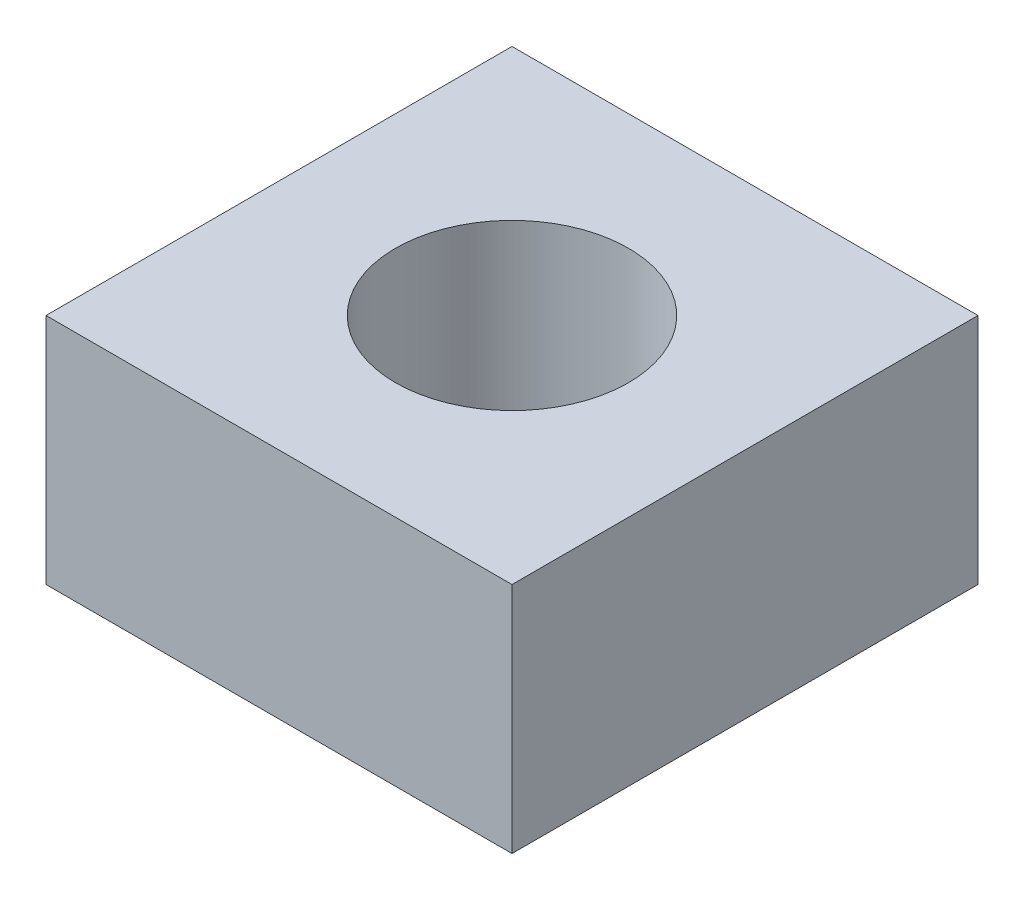
ISO-10303-21;
HEADER;
FILE_DESCRIPTION(('STEP AP214'),'2;1');
FILE_NAME('part.step','',(''),(''),'','','');
FILE_SCHEMA(('AUTOMOTIVE_DESIGN { 1 0 10303 214 1 1 1 1 }'));
ENDSEC;
DATA;
#1=APPLICATION_CONTEXT('core data for automotive mechanical design processes');
#2=APPLICATION_PROTOCOL_DEFINITION('international standard','automotive_design',2000,#1);
#3=PRODUCT_CONTEXT('',#1,'mechanical');
#4=PRODUCT('Part','Part','',(#3));
#5=PRODUCT_RELATED_PRODUCT_CATEGORY('part','',(#4));
#6=PRODUCT_DEFINITION_FORMATION('','',#4);
#7=PRODUCT_DEFINITION_CONTEXT('part definition',#1,'design');
#8=PRODUCT_DEFINITION('design','',#6,#7);
#9=PRODUCT_DEFINITION_SHAPE('','',#8);
#10=(LENGTH_UNIT() NAMED_UNIT(*) SI_UNIT(.MILLI.,.METRE.));
#11=(NAMED_UNIT(*) PLANE_ANGLE_UNIT() SI_UNIT($,.RADIAN.));
#12=(NAMED_UNIT(*) SI_UNIT($,.STERADIAN.) SOLID_ANGLE_UNIT());
#13=UNCERTAINTY_MEASURE_WITH_UNIT(LENGTH_MEASURE(1.E-05),#10,'distance_accuracy_value','');
#14=(GEOMETRIC_REPRESENTATION_CONTEXT(3) GLOBAL_UNCERTAINTY_ASSIGNED_CONTEXT((#13)) GLOBAL_UNIT_ASSIGNED_CONTEXT((#10,
#11,#12)) REPRESENTATION_CONTEXT('',''));
#15=CARTESIAN_POINT('',(0.,0.,0.));
#16=DIRECTION('',(0.,0.,1.));
#17=DIRECTION('',(1.,0.,0.));
#18=AXIS2_PLACEMENT_3D('',#15,#16,#17);
#19=CARTESIAN_POINT('',(-3.,3.,3.));
#20=DIRECTION('',(1.,0.,0.));
#21=DIRECTION('',(0.,0.,-1.));
#22=AXIS2_PLACEMENT_3D('',#19,#20,#21);
#23=PLANE('',#22);
#24=DIRECTION('',(0.,0.,1.));
#25=VECTOR('',#24,1.);
#26=CARTESIAN_POINT('',(-3.,0.,3.));
#27=LINE('',#26,#25);
#28=CARTESIAN_POINT('',(-3.,0.,-3.));
#29=VERTEX_POINT('',#28);
#30=CARTESIAN_POINT('',(-3.,0.,3.));
#31=VERTEX_POINT('',#30);
#32=EDGE_CURVE('E94',#29,#31,#27,.T.);
#33=ORIENTED_EDGE('',*,*,#32,.T.);
#34=DIRECTION('',(0.,-1.,0.));
#35=VECTOR('',#34,1.);
#36=CARTESIAN_POINT('',(-3.,3.,3.));
#37=LINE('',#36,#35);
#38=CARTESIAN_POINT('',(-3.,3.,3.));
#39=VERTEX_POINT('',#38);
#40=EDGE_CURVE('E11',#39,#31,#37,.T.);
#41=ORIENTED_EDGE('',*,*,#40,.F.);
#42=DIRECTION('',(0.,0.,1.));
#43=VECTOR('',#42,1.);
#44=CARTESIAN_POINT('',(-3.,3.,3.));
#45=LINE('',#44,#43);
#46=CARTESIAN_POINT('',(-3.,3.,-3.));
#47=VERTEX_POINT('',#46);
#48=EDGE_CURVE('E82',#47,#39,#45,.T.);
#49=ORIENTED_EDGE('',*,*,#48,.F.);
#50=DIRECTION('',(0.,-1.,0.));
#51=VECTOR('',#50,1.);
#52=CARTESIAN_POINT('',(-3.,3.,-3.));
#53=LINE('',#52,#51);
#54=EDGE_CURVE('E90',#47,#29,#53,.T.);
#55=ORIENTED_EDGE('',*,*,#54,.T.);
#56=EDGE_LOOP('',(#33,#41,#49,#55));
#57=FACE_BOUND('',#56,.T.);
#58=ADVANCED_FACE('F31',(#57),#23,.F.);
#59=CARTESIAN_POINT('',(3.,3.,3.));
#60=DIRECTION('',(0.,0.,-1.));
#61=DIRECTION('',(-1.,0.,0.));
#62=AXIS2_PLACEMENT_3D('',#59,#60,#61);
#63=PLANE('',#62);
#64=DIRECTION('',(1.,0.,0.));
#65=VECTOR('',#64,1.);
#66=CARTESIAN_POINT('',(3.,0.,3.));
#67=LINE('',#66,#65);
#68=CARTESIAN_POINT('',(3.,0.,3.));
#69=VERTEX_POINT('',#68);
#70=EDGE_CURVE('E86',#31,#69,#67,.T.);
#71=ORIENTED_EDGE('',*,*,#70,.T.);
#72=DIRECTION('',(0.,-1.,0.));
#73=VECTOR('',#72,1.);
#74=CARTESIAN_POINT('',(3.,3.,3.));
#75=LINE('',#74,#73);
#76=CARTESIAN_POINT('',(3.,3.,3.));
#77=VERTEX_POINT('',#76);
#78=EDGE_CURVE('E39',#77,#69,#75,.T.);
#79=ORIENTED_EDGE('',*,*,#78,.F.);
#80=DIRECTION('',(1.,0.,0.));
#81=VECTOR('',#80,1.);
#82=CARTESIAN_POINT('',(3.,3.,3.));
#83=LINE('',#82,#81);
#84=EDGE_CURVE('E77',#39,#77,#83,.T.);
#85=ORIENTED_EDGE('',*,*,#84,.F.);
#86=ORIENTED_EDGE('',*,*,#40,.T.);
#87=EDGE_LOOP('',(#71,#79,#85,#86));
#88=FACE_BOUND('',#87,.T.);
#89=ADVANCED_FACE('F85',(#88),#63,.F.);
#90=CARTESIAN_POINT('',(3.,3.,3.));
#91=DIRECTION('',(-1.,0.,0.));
#92=DIRECTION('',(0.,0.,1.));
#93=AXIS2_PLACEMENT_3D('',#90,#91,#92);
#94=PLANE('',#93);
#95=DIRECTION('',(0.,0.,-1.));
#96=VECTOR('',#95,1.);
#97=CARTESIAN_POINT('',(3.,0.,3.));
#98=LINE('',#97,#96);
#99=CARTESIAN_POINT('',(3.,0.,-3.));
#100=VERTEX_POINT('',#99);
#101=EDGE_CURVE('E64',#69,#100,#98,.T.);
#102=ORIENTED_EDGE('',*,*,#101,.T.);
#103=DIRECTION('',(0.,-1.,0.));
#104=VECTOR('',#103,1.);
#105=CARTESIAN_POINT('',(3.,3.,-3.));
#106=LINE('',#105,#104);
#107=CARTESIAN_POINT('',(3.,3.,-3.));
#108=VERTEX_POINT('',#107);
#109=EDGE_CURVE('E87',#108,#100,#106,.T.);
#110=ORIENTED_EDGE('',*,*,#109,.F.);
#111=DIRECTION('',(0.,0.,-1.));
#112=VECTOR('',#111,1.);
#113=CARTESIAN_POINT('',(3.,3.,3.));
#114=LINE('',#113,#112);
#115=EDGE_CURVE('E80',#77,#108,#114,.T.);
#116=ORIENTED_EDGE('',*,*,#115,.F.);
#117=ORIENTED_EDGE('',*,*,#78,.T.);
#118=EDGE_LOOP('',(#102,#110,#116,#117));
#119=FACE_BOUND('',#118,.T.);
#120=ADVANCED_FACE('F88',(#119),#94,.F.);
#121=CARTESIAN_POINT('',(3.,3.,-3.));
#122=DIRECTION('',(0.,0.,1.));
#123=DIRECTION('',(1.,0.,0.));
#124=AXIS2_PLACEMENT_3D('',#121,#122,#123);
#125=PLANE('',#124);
#126=DIRECTION('',(-1.,0.,0.));
#127=VECTOR('',#126,1.);
#128=CARTESIAN_POINT('',(3.,0.,-3.));
#129=LINE('',#128,#127);
#130=EDGE_CURVE('E70',#100,#29,#129,.T.);
#131=ORIENTED_EDGE('',*,*,#130,.T.);
#132=ORIENTED_EDGE('',*,*,#54,.F.);
#133=DIRECTION('',(-1.,0.,0.));
#134=VECTOR('',#133,1.);
#135=CARTESIAN_POINT('',(3.,3.,-3.));
#136=LINE('',#135,#134);
#137=EDGE_CURVE('E47',#108,#47,#136,.T.);
#138=ORIENTED_EDGE('',*,*,#137,.F.);
#139=ORIENTED_EDGE('',*,*,#109,.T.);
#140=EDGE_LOOP('',(#131,#132,#138,#139));
#141=FACE_BOUND('',#140,.T.);
#142=ADVANCED_FACE('F102',(#141),#125,.F.);
#143=CARTESIAN_POINT('',(-3.,3.,-3.));
#144=DIRECTION('',(0.,1.,0.));
#145=DIRECTION('',(0.,0.,1.));
#146=AXIS2_PLACEMENT_3D('',#143,#144,#145);
#147=PLANE('',#146);
#148=CARTESIAN_POINT('',(0.,3.,0.));
#149=DIRECTION('',(0.,1.,0.));
#150=DIRECTION('',(0.,0.,1.));
#151=AXIS2_PLACEMENT_3D('',#148,#149,#150);
#152=CIRCLE('',#151,1.5);
#153=CARTESIAN_POINT('',(0.,3.,1.5));
#154=VERTEX_POINT('',#153);
#155=EDGE_CURVE('E108',#154,#154,#152,.T.);
#156=ORIENTED_EDGE('',*,*,#155,.F.);
#157=EDGE_LOOP('',(#156));
#158=FACE_BOUND('',#157,.T.);
#159=ORIENTED_EDGE('',*,*,#48,.T.);
#160=ORIENTED_EDGE('',*,*,#84,.T.);
#161=ORIENTED_EDGE('',*,*,#115,.T.);
#162=ORIENTED_EDGE('',*,*,#137,.T.);
#163=EDGE_LOOP('',(#159,#160,#161,#162));
#164=FACE_BOUND('',#163,.T.);
#165=ADVANCED_FACE('F78',(#158,#164),#147,.T.);
#166=CARTESIAN_POINT('',(-3.,0.,-3.));
#167=DIRECTION('',(0.,1.,0.));
#168=DIRECTION('',(0.,0.,1.));
#169=AXIS2_PLACEMENT_3D('',#166,#167,#168);
#170=PLANE('',#169);
#171=CARTESIAN_POINT('',(0.,0.,0.));
#172=DIRECTION('',(0.,1.,0.));
#173=DIRECTION('',(0.,0.,1.));
#174=AXIS2_PLACEMENT_3D('',#171,#172,#173);
#175=CIRCLE('',#174,1.5);
#176=CARTESIAN_POINT('',(0.,0.,1.5));
#177=VERTEX_POINT('',#176);
#178=EDGE_CURVE('E97',#177,#177,#175,.T.);
#179=ORIENTED_EDGE('',*,*,#178,.T.);
#180=EDGE_LOOP('',(#179));
#181=FACE_BOUND('',#180,.T.);
#182=ORIENTED_EDGE('',*,*,#32,.F.);
#183=ORIENTED_EDGE('',*,*,#130,.F.);
#184=ORIENTED_EDGE('',*,*,#101,.F.);
#185=ORIENTED_EDGE('',*,*,#70,.F.);
#186=EDGE_LOOP('',(#182,#183,#184,#185));
#187=FACE_BOUND('',#186,.T.);
#188=ADVANCED_FACE('F105',(#181,#187),#170,.F.);
#189=CARTESIAN_POINT('',(0.,0.,0.));
#190=DIRECTION('',(0.,1.,0.));
#191=DIRECTION('',(0.,0.,1.));
#192=AXIS2_PLACEMENT_3D('',#189,#190,#191);
#193=CYLINDRICAL_SURFACE('',#192,1.5);
#194=ORIENTED_EDGE('',*,*,#178,.F.);
#195=EDGE_LOOP('',(#194));
#196=FACE_BOUND('',#195,.T.);
#197=ORIENTED_EDGE('',*,*,#155,.T.);
#198=EDGE_LOOP('',(#197));
#199=FACE_BOUND('',#198,.T.);
#200=ADVANCED_FACE('F115',(#196,#199),#193,.F.);
#201=CLOSED_SHELL('',(#58,#89,#120,#142,#165,#188,#200));
#202=MANIFOLD_SOLID_BREP('B2',#201);
#203=ADVANCED_BREP_SHAPE_REPRESENTATION('',(#18,#202),#14);
#204=SHAPE_DEFINITION_REPRESENTATION(#9,#203);
ENDSEC;
END-ISO-10303-21;
